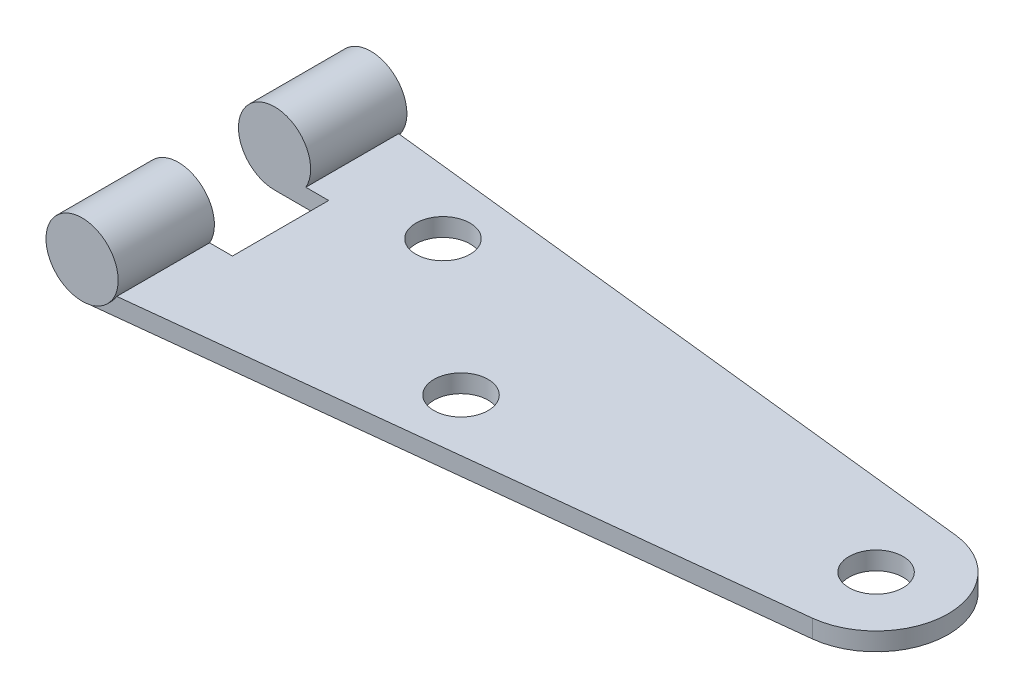
ISO-10303-21;
HEADER;
FILE_DESCRIPTION(('STEP AP214'),'2;1');
FILE_NAME('part.step','',(''),(''),'','','');
FILE_SCHEMA(('AUTOMOTIVE_DESIGN { 1 0 10303 214 1 1 1 1 }'));
ENDSEC;
DATA;
#1=APPLICATION_CONTEXT('core data for automotive mechanical design processes');
#2=APPLICATION_PROTOCOL_DEFINITION('international standard','automotive_design',2000,#1);
#3=PRODUCT_CONTEXT('',#1,'mechanical');
#4=PRODUCT('Part','Part','',(#3));
#5=PRODUCT_RELATED_PRODUCT_CATEGORY('part','',(#4));
#6=PRODUCT_DEFINITION_FORMATION('','',#4);
#7=PRODUCT_DEFINITION_CONTEXT('part definition',#1,'design');
#8=PRODUCT_DEFINITION('design','',#6,#7);
#9=PRODUCT_DEFINITION_SHAPE('','',#8);
#10=(LENGTH_UNIT() NAMED_UNIT(*) SI_UNIT(.MILLI.,.METRE.));
#11=(NAMED_UNIT(*) PLANE_ANGLE_UNIT() SI_UNIT($,.RADIAN.));
#12=(NAMED_UNIT(*) SI_UNIT($,.STERADIAN.) SOLID_ANGLE_UNIT());
#13=UNCERTAINTY_MEASURE_WITH_UNIT(LENGTH_MEASURE(1.E-05),#10,'distance_accuracy_value','');
#14=(GEOMETRIC_REPRESENTATION_CONTEXT(3) GLOBAL_UNCERTAINTY_ASSIGNED_CONTEXT((#13)) GLOBAL_UNIT_ASSIGNED_CONTEXT((#10,
#11,#12)) REPRESENTATION_CONTEXT('',''));
#15=CARTESIAN_POINT('',(0.,0.,0.));
#16=DIRECTION('',(0.,0.,1.));
#17=DIRECTION('',(1.,0.,0.));
#18=AXIS2_PLACEMENT_3D('',#15,#16,#17);
#19=CARTESIAN_POINT('',(-57.15,3.175,-12.7));
#20=DIRECTION('',(0.,0.,-1.));
#21=DIRECTION('',(-1.,0.,0.));
#22=AXIS2_PLACEMENT_3D('',#19,#20,#21);
#23=CYLINDRICAL_SURFACE('',#22,3.175);
#24=CARTESIAN_POINT('',(-57.15,3.175,-4.23333333333333));
#25=DIRECTION('',(0.,0.,-1.));
#26=DIRECTION('',(-1.,0.,0.));
#27=AXIS2_PLACEMENT_3D('',#24,#25,#26);
#28=CIRCLE('',#27,3.175);
#29=CARTESIAN_POINT('',(-54.4003693429844,1.5875,-4.23333333333333));
#30=VERTEX_POINT('',#29);
#31=CARTESIAN_POINT('',(-57.15,0.,-4.23333333333333));
#32=VERTEX_POINT('',#31);
#33=EDGE_CURVE('E44',#30,#32,#28,.F.);
#34=ORIENTED_EDGE('',*,*,#33,.F.);
#35=DIRECTION('',(0.,0.,-1.));
#36=VECTOR('',#35,1.);
#37=CARTESIAN_POINT('',(-54.4003693429844,1.5875,-12.7));
#38=LINE('',#37,#36);
#39=CARTESIAN_POINT('',(-54.4003693429844,1.5875,-12.3963428676451));
#40=VERTEX_POINT('',#39);
#41=EDGE_CURVE('E143',#30,#40,#38,.T.);
#42=ORIENTED_EDGE('',*,*,#41,.T.);
#43=CARTESIAN_POINT('',(-57.15,3.175,-12.7));
#44=DIRECTION('',(-0.109768267997922,0.,0.993957205990649));
#45=DIRECTION('',(-0.993957205990649,0.,-0.109768267997922));
#46=AXIS2_PLACEMENT_3D('',#43,#44,#45);
#47=ELLIPSE('',#46,3.19430251208408,3.175);
#48=CARTESIAN_POINT('',(-57.15,0.,-12.7));
#49=VERTEX_POINT('',#48);
#50=EDGE_CURVE('E136',#49,#40,#47,.T.);
#51=ORIENTED_EDGE('',*,*,#50,.F.);
#52=CARTESIAN_POINT('',(-57.15,3.175,-12.7));
#53=DIRECTION('',(0.,0.,-1.));
#54=DIRECTION('',(-1.,0.,0.));
#55=AXIS2_PLACEMENT_3D('',#52,#53,#54);
#56=CIRCLE('',#55,3.175);
#57=EDGE_CURVE('E135',#49,#49,#56,.T.);
#58=ORIENTED_EDGE('',*,*,#57,.F.);
#59=DIRECTION('',(0.,0.,1.));
#60=VECTOR('',#59,1.);
#61=CARTESIAN_POINT('',(-57.15,0.,-12.7));
#62=LINE('',#61,#60);
#63=EDGE_CURVE('E93',#49,#32,#62,.T.);
#64=ORIENTED_EDGE('',*,*,#63,.T.);
#65=EDGE_LOOP('',(#34,#42,#51,#58,#64));
#66=FACE_BOUND('',#65,.T.);
#67=ADVANCED_FACE('F35',(#66),#23,.T.);
#68=CARTESIAN_POINT('',(0.,1.5875,0.));
#69=DIRECTION('',(0.,1.,0.));
#70=DIRECTION('',(0.,0.,1.));
#71=AXIS2_PLACEMENT_3D('',#68,#69,#70);
#72=PLANE('',#71);
#73=DIRECTION('',(1.,0.,0.));
#74=VECTOR('',#73,1.);
#75=CARTESIAN_POINT('',(0.,1.5875,4.23333333333332));
#76=LINE('',#75,#74);
#77=CARTESIAN_POINT('',(-54.4003693429844,1.5875,4.23333333333333));
#78=VERTEX_POINT('',#77);
#79=CARTESIAN_POINT('',(-52.3875,1.5875,4.23333333333333));
#80=VERTEX_POINT('',#79);
#81=EDGE_CURVE('E220',#78,#80,#76,.T.);
#82=ORIENTED_EDGE('',*,*,#81,.F.);
#83=CARTESIAN_POINT('',(-54.4003693429844,1.5875,12.3963428676451));
#84=VERTEX_POINT('',#83);
#85=EDGE_CURVE('E150',#84,#78,#38,.T.);
#86=ORIENTED_EDGE('',*,*,#85,.F.);
#87=DIRECTION('',(0.993957205990649,0.,-0.109768267997922));
#88=VECTOR('',#87,1.);
#89=CARTESIAN_POINT('',(-57.15,1.5875,12.7));
#90=LINE('',#89,#88);
#91=CARTESIAN_POINT('',(0.697028501786803,1.5875,6.31162825804061));
#92=VERTEX_POINT('',#91);
#93=EDGE_CURVE('E167',#84,#92,#90,.T.);
#94=ORIENTED_EDGE('',*,*,#93,.T.);
#95=CARTESIAN_POINT('',(0.,1.5875,0.));
#96=DIRECTION('',(0.,1.,0.));
#97=DIRECTION('',(0.,0.,1.));
#98=AXIS2_PLACEMENT_3D('',#95,#96,#97);
#99=CIRCLE('',#98,6.35);
#100=CARTESIAN_POINT('',(0.697028501786803,1.5875,-6.31162825804062));
#101=VERTEX_POINT('',#100);
#102=EDGE_CURVE('E52',#92,#101,#99,.T.);
#103=ORIENTED_EDGE('',*,*,#102,.T.);
#104=DIRECTION('',(-0.993957205990649,0.,-0.109768267997922));
#105=VECTOR('',#104,1.);
#106=CARTESIAN_POINT('',(-57.15,1.5875,-12.7));
#107=LINE('',#106,#105);
#108=EDGE_CURVE('E79',#101,#40,#107,.T.);
#109=ORIENTED_EDGE('',*,*,#108,.T.);
#110=ORIENTED_EDGE('',*,*,#41,.F.);
#111=DIRECTION('',(-1.,0.,0.));
#112=VECTOR('',#111,1.);
#113=CARTESIAN_POINT('',(0.,1.5875,-4.23333333333334));
#114=LINE('',#113,#112);
#115=CARTESIAN_POINT('',(-52.3875,1.5875,-4.23333333333333));
#116=VERTEX_POINT('',#115);
#117=EDGE_CURVE('E120',#116,#30,#114,.T.);
#118=ORIENTED_EDGE('',*,*,#117,.F.);
#119=DIRECTION('',(0.,0.,-1.));
#120=VECTOR('',#119,1.);
#121=CARTESIAN_POINT('',(-52.3875,1.5875,0.));
#122=LINE('',#121,#120);
#123=EDGE_CURVE('E146',#80,#116,#122,.T.);
#124=ORIENTED_EDGE('',*,*,#123,.F.);
#125=EDGE_LOOP('',(#82,#86,#94,#103,#109,#110,#118,#124));
#126=FACE_BOUND('',#125,.T.);
#127=CARTESIAN_POINT('',(-44.45,1.5875,-6.35));
#128=DIRECTION('',(0.,1.,0.));
#129=DIRECTION('',(0.,0.,1.));
#130=AXIS2_PLACEMENT_3D('',#127,#128,#129);
#131=CIRCLE('',#130,2.38125);
#132=CARTESIAN_POINT('',(-44.45,1.5875,-3.96875));
#133=VERTEX_POINT('',#132);
#134=EDGE_CURVE('E160',#133,#133,#131,.T.);
#135=ORIENTED_EDGE('',*,*,#134,.F.);
#136=EDGE_LOOP('',(#135));
#137=FACE_BOUND('',#136,.T.);
#138=CARTESIAN_POINT('',(0.,1.5875,0.));
#139=DIRECTION('',(0.,1.,0.));
#140=DIRECTION('',(0.,0.,1.));
#141=AXIS2_PLACEMENT_3D('',#138,#139,#140);
#142=CIRCLE('',#141,2.38125);
#143=CARTESIAN_POINT('',(0.,1.5875,2.38125));
#144=VERTEX_POINT('',#143);
#145=EDGE_CURVE('E95',#144,#144,#142,.T.);
#146=ORIENTED_EDGE('',*,*,#145,.F.);
#147=EDGE_LOOP('',(#146));
#148=FACE_BOUND('',#147,.T.);
#149=CARTESIAN_POINT('',(-31.75,1.5875,4.7625));
#150=DIRECTION('',(0.,1.,0.));
#151=DIRECTION('',(0.,0.,1.));
#152=AXIS2_PLACEMENT_3D('',#149,#150,#151);
#153=CIRCLE('',#152,2.38125);
#154=CARTESIAN_POINT('',(-31.75,1.5875,7.14375));
#155=VERTEX_POINT('',#154);
#156=EDGE_CURVE('E154',#155,#155,#153,.T.);
#157=ORIENTED_EDGE('',*,*,#156,.F.);
#158=EDGE_LOOP('',(#157));
#159=FACE_BOUND('',#158,.T.);
#160=ADVANCED_FACE('F171',(#126,#137,#148,#159),#72,.T.);
#161=CARTESIAN_POINT('',(0.,0.,0.));
#162=DIRECTION('',(0.,1.,0.));
#163=DIRECTION('',(0.,0.,1.));
#164=AXIS2_PLACEMENT_3D('',#161,#162,#163);
#165=PLANE('',#164);
#166=CARTESIAN_POINT('',(-44.45,0.,-6.35));
#167=DIRECTION('',(0.,1.,0.));
#168=DIRECTION('',(0.,0.,1.));
#169=AXIS2_PLACEMENT_3D('',#166,#167,#168);
#170=CIRCLE('',#169,2.38125);
#171=CARTESIAN_POINT('',(-44.45,0.,-3.96875));
#172=VERTEX_POINT('',#171);
#173=EDGE_CURVE('E157',#172,#172,#170,.T.);
#174=ORIENTED_EDGE('',*,*,#173,.T.);
#175=EDGE_LOOP('',(#174));
#176=FACE_BOUND('',#175,.T.);
#177=CARTESIAN_POINT('',(-57.15,0.,4.23333333333333));
#178=VERTEX_POINT('',#177);
#179=CARTESIAN_POINT('',(-57.15,0.,12.7));
#180=VERTEX_POINT('',#179);
#181=EDGE_CURVE('E94',#178,#180,#62,.T.);
#182=ORIENTED_EDGE('',*,*,#181,.F.);
#183=DIRECTION('',(1.,0.,0.));
#184=VECTOR('',#183,1.);
#185=CARTESIAN_POINT('',(-52.3875,0.,4.23333333333333));
#186=LINE('',#185,#184);
#187=CARTESIAN_POINT('',(-52.3875,0.,4.23333333333333));
#188=VERTEX_POINT('',#187);
#189=EDGE_CURVE('E130',#178,#188,#186,.T.);
#190=ORIENTED_EDGE('',*,*,#189,.T.);
#191=DIRECTION('',(0.,0.,-1.));
#192=VECTOR('',#191,1.);
#193=CARTESIAN_POINT('',(-52.3875,0.,-4.23333333333333));
#194=LINE('',#193,#192);
#195=CARTESIAN_POINT('',(-52.3875,0.,-4.23333333333333));
#196=VERTEX_POINT('',#195);
#197=EDGE_CURVE('E129',#188,#196,#194,.T.);
#198=ORIENTED_EDGE('',*,*,#197,.T.);
#199=DIRECTION('',(-1.,0.,0.));
#200=VECTOR('',#199,1.);
#201=CARTESIAN_POINT('',(-52.3875,0.,-4.23333333333333));
#202=LINE('',#201,#200);
#203=EDGE_CURVE('E116',#196,#32,#202,.T.);
#204=ORIENTED_EDGE('',*,*,#203,.T.);
#205=ORIENTED_EDGE('',*,*,#63,.F.);
#206=DIRECTION('',(-0.993957205990649,0.,-0.109768267997922));
#207=VECTOR('',#206,1.);
#208=CARTESIAN_POINT('',(-57.15,0.,-12.7));
#209=LINE('',#208,#207);
#210=CARTESIAN_POINT('',(0.697028501786803,0.,-6.31162825804062));
#211=VERTEX_POINT('',#210);
#212=EDGE_CURVE('E85',#211,#49,#209,.T.);
#213=ORIENTED_EDGE('',*,*,#212,.F.);
#214=CARTESIAN_POINT('',(0.,0.,0.));
#215=DIRECTION('',(0.,1.,0.));
#216=DIRECTION('',(0.,0.,1.));
#217=AXIS2_PLACEMENT_3D('',#214,#215,#216);
#218=CIRCLE('',#217,6.35);
#219=CARTESIAN_POINT('',(0.697028501786803,0.,6.31162825804061));
#220=VERTEX_POINT('',#219);
#221=EDGE_CURVE('E71',#220,#211,#218,.T.);
#222=ORIENTED_EDGE('',*,*,#221,.F.);
#223=DIRECTION('',(0.993957205990649,0.,-0.109768267997922));
#224=VECTOR('',#223,1.);
#225=CARTESIAN_POINT('',(-57.15,0.,12.7));
#226=LINE('',#225,#224);
#227=EDGE_CURVE('E66',#180,#220,#226,.T.);
#228=ORIENTED_EDGE('',*,*,#227,.F.);
#229=EDGE_LOOP('',(#182,#190,#198,#204,#205,#213,#222,#228));
#230=FACE_BOUND('',#229,.T.);
#231=CARTESIAN_POINT('',(0.,0.,0.));
#232=DIRECTION('',(0.,1.,0.));
#233=DIRECTION('',(0.,0.,1.));
#234=AXIS2_PLACEMENT_3D('',#231,#232,#233);
#235=CIRCLE('',#234,2.38125);
#236=CARTESIAN_POINT('',(0.,0.,2.38125));
#237=VERTEX_POINT('',#236);
#238=EDGE_CURVE('E99',#237,#237,#235,.T.);
#239=ORIENTED_EDGE('',*,*,#238,.T.);
#240=EDGE_LOOP('',(#239));
#241=FACE_BOUND('',#240,.T.);
#242=CARTESIAN_POINT('',(-31.75,0.,4.7625));
#243=DIRECTION('',(0.,1.,0.));
#244=DIRECTION('',(0.,0.,1.));
#245=AXIS2_PLACEMENT_3D('',#242,#243,#244);
#246=CIRCLE('',#245,2.38125);
#247=CARTESIAN_POINT('',(-31.75,0.,7.14375));
#248=VERTEX_POINT('',#247);
#249=EDGE_CURVE('E153',#248,#248,#246,.T.);
#250=ORIENTED_EDGE('',*,*,#249,.T.);
#251=EDGE_LOOP('',(#250));
#252=FACE_BOUND('',#251,.T.);
#253=ADVANCED_FACE('F89',(#176,#230,#241,#252),#165,.F.);
#254=CARTESIAN_POINT('',(-57.15,1.5875,-12.7));
#255=DIRECTION('',(-0.109768267997922,0.,0.993957205990649));
#256=DIRECTION('',(0.993957205990649,0.,0.109768267997922));
#257=AXIS2_PLACEMENT_3D('',#254,#255,#256);
#258=PLANE('',#257);
#259=ORIENTED_EDGE('',*,*,#212,.T.);
#260=ORIENTED_EDGE('',*,*,#50,.T.);
#261=ORIENTED_EDGE('',*,*,#108,.F.);
#262=DIRECTION('',(0.,-1.,0.));
#263=VECTOR('',#262,1.);
#264=CARTESIAN_POINT('',(0.697028501786803,1.5875,-6.31162825804062));
#265=LINE('',#264,#263);
#266=EDGE_CURVE('E74',#101,#211,#265,.T.);
#267=ORIENTED_EDGE('',*,*,#266,.T.);
#268=EDGE_LOOP('',(#259,#260,#261,#267));
#269=FACE_BOUND('',#268,.T.);
#270=ADVANCED_FACE('F37',(#269),#258,.F.);
#271=CARTESIAN_POINT('',(-57.15,1.5875,12.7));
#272=DIRECTION('',(-0.109768267997922,0.,-0.993957205990649));
#273=DIRECTION('',(-0.993957205990649,0.,0.109768267997922));
#274=AXIS2_PLACEMENT_3D('',#271,#272,#273);
#275=PLANE('',#274);
#276=ORIENTED_EDGE('',*,*,#93,.F.);
#277=CARTESIAN_POINT('',(-57.15,3.175,12.7));
#278=DIRECTION('',(-0.109768267997922,0.,-0.993957205990649));
#279=DIRECTION('',(0.993957205990649,0.,-0.109768267997922));
#280=AXIS2_PLACEMENT_3D('',#277,#278,#279);
#281=ELLIPSE('',#280,3.19430251208408,3.175);
#282=EDGE_CURVE('E106',#84,#180,#281,.T.);
#283=ORIENTED_EDGE('',*,*,#282,.T.);
#284=ORIENTED_EDGE('',*,*,#227,.T.);
#285=DIRECTION('',(0.,-1.,0.));
#286=VECTOR('',#285,1.);
#287=CARTESIAN_POINT('',(0.697028501786803,1.5875,6.31162825804061));
#288=LINE('',#287,#286);
#289=EDGE_CURVE('E76',#92,#220,#288,.T.);
#290=ORIENTED_EDGE('',*,*,#289,.F.);
#291=EDGE_LOOP('',(#276,#283,#284,#290));
#292=FACE_BOUND('',#291,.T.);
#293=ADVANCED_FACE('F173',(#292),#275,.F.);
#294=CARTESIAN_POINT('',(0.,1.5875,0.));
#295=DIRECTION('',(0.,-1.,0.));
#296=DIRECTION('',(0.,0.,-1.));
#297=AXIS2_PLACEMENT_3D('',#294,#295,#296);
#298=CYLINDRICAL_SURFACE('',#297,6.35);
#299=ORIENTED_EDGE('',*,*,#221,.T.);
#300=ORIENTED_EDGE('',*,*,#266,.F.);
#301=ORIENTED_EDGE('',*,*,#102,.F.);
#302=ORIENTED_EDGE('',*,*,#289,.T.);
#303=EDGE_LOOP('',(#299,#300,#301,#302));
#304=FACE_BOUND('',#303,.T.);
#305=ADVANCED_FACE('F73',(#304),#298,.T.);
#306=CARTESIAN_POINT('',(0.,1.5875,0.));
#307=DIRECTION('',(0.,-1.,0.));
#308=DIRECTION('',(0.,0.,-1.));
#309=AXIS2_PLACEMENT_3D('',#306,#307,#308);
#310=CYLINDRICAL_SURFACE('',#309,2.38125);
#311=ORIENTED_EDGE('',*,*,#145,.T.);
#312=EDGE_LOOP('',(#311));
#313=FACE_BOUND('',#312,.T.);
#314=ORIENTED_EDGE('',*,*,#238,.F.);
#315=EDGE_LOOP('',(#314));
#316=FACE_BOUND('',#315,.T.);
#317=ADVANCED_FACE('F179',(#313,#316),#310,.F.);
#318=CARTESIAN_POINT('',(-44.45,1.5875,-6.35));
#319=DIRECTION('',(0.,-1.,0.));
#320=DIRECTION('',(0.,0.,-1.));
#321=AXIS2_PLACEMENT_3D('',#318,#319,#320);
#322=CYLINDRICAL_SURFACE('',#321,2.38125);
#323=ORIENTED_EDGE('',*,*,#134,.T.);
#324=EDGE_LOOP('',(#323));
#325=FACE_BOUND('',#324,.T.);
#326=ORIENTED_EDGE('',*,*,#173,.F.);
#327=EDGE_LOOP('',(#326));
#328=FACE_BOUND('',#327,.T.);
#329=ADVANCED_FACE('F306',(#325,#328),#322,.F.);
#330=CARTESIAN_POINT('',(-31.75,1.5875,4.7625));
#331=DIRECTION('',(0.,-1.,0.));
#332=DIRECTION('',(0.,0.,-1.));
#333=AXIS2_PLACEMENT_3D('',#330,#331,#332);
#334=CYLINDRICAL_SURFACE('',#333,2.38125);
#335=ORIENTED_EDGE('',*,*,#156,.T.);
#336=EDGE_LOOP('',(#335));
#337=FACE_BOUND('',#336,.T.);
#338=ORIENTED_EDGE('',*,*,#249,.F.);
#339=EDGE_LOOP('',(#338));
#340=FACE_BOUND('',#339,.T.);
#341=ADVANCED_FACE('F200',(#337,#340),#334,.F.);
#342=CARTESIAN_POINT('',(-57.15,3.175,-12.7));
#343=DIRECTION('',(0.,0.,-1.));
#344=DIRECTION('',(-1.,0.,0.));
#345=AXIS2_PLACEMENT_3D('',#342,#343,#344);
#346=PLANE('',#345);
#347=ORIENTED_EDGE('',*,*,#57,.T.);
#348=EDGE_LOOP('',(#347));
#349=FACE_BOUND('',#348,.T.);
#350=ADVANCED_FACE('F192',(#349),#346,.T.);
#351=CARTESIAN_POINT('',(-57.15,3.175,4.23333333333333));
#352=DIRECTION('',(0.,0.,1.));
#353=DIRECTION('',(1.,0.,0.));
#354=AXIS2_PLACEMENT_3D('',#351,#352,#353);
#355=CIRCLE('',#354,3.175);
#356=EDGE_CURVE('E11',#178,#78,#355,.F.);
#357=ORIENTED_EDGE('',*,*,#356,.F.);
#358=ORIENTED_EDGE('',*,*,#181,.T.);
#359=CARTESIAN_POINT('',(-57.15,3.175,12.7));
#360=DIRECTION('',(0.,0.,-1.));
#361=DIRECTION('',(-1.,0.,0.));
#362=AXIS2_PLACEMENT_3D('',#359,#360,#361);
#363=CIRCLE('',#362,3.175);
#364=EDGE_CURVE('E141',#180,#180,#363,.T.);
#365=ORIENTED_EDGE('',*,*,#364,.T.);
#366=ORIENTED_EDGE('',*,*,#282,.F.);
#367=ORIENTED_EDGE('',*,*,#85,.T.);
#368=EDGE_LOOP('',(#357,#358,#365,#366,#367));
#369=FACE_BOUND('',#368,.T.);
#370=ADVANCED_FACE('F183',(#369),#23,.T.);
#371=CARTESIAN_POINT('',(-57.15,3.175,12.7));
#372=DIRECTION('',(0.,0.,1.));
#373=DIRECTION('',(1.,0.,0.));
#374=AXIS2_PLACEMENT_3D('',#371,#372,#373);
#375=PLANE('',#374);
#376=ORIENTED_EDGE('',*,*,#364,.F.);
#377=EDGE_LOOP('',(#376));
#378=FACE_BOUND('',#377,.T.);
#379=ADVANCED_FACE('F191',(#378),#375,.T.);
#380=CARTESIAN_POINT('',(-52.3875,0.,-4.23333333333333));
#381=DIRECTION('',(1.,0.,0.));
#382=DIRECTION('',(0.,0.,-1.));
#383=AXIS2_PLACEMENT_3D('',#380,#381,#382);
#384=PLANE('',#383);
#385=ORIENTED_EDGE('',*,*,#123,.T.);
#386=DIRECTION('',(0.,1.,0.));
#387=VECTOR('',#386,1.);
#388=CARTESIAN_POINT('',(-52.3875,0.,-4.23333333333333));
#389=LINE('',#388,#387);
#390=EDGE_CURVE('E213',#196,#116,#389,.T.);
#391=ORIENTED_EDGE('',*,*,#390,.F.);
#392=ORIENTED_EDGE('',*,*,#197,.F.);
#393=DIRECTION('',(0.,1.,0.));
#394=VECTOR('',#393,1.);
#395=CARTESIAN_POINT('',(-52.3875,0.,4.23333333333333));
#396=LINE('',#395,#394);
#397=EDGE_CURVE('E212',#188,#80,#396,.T.);
#398=ORIENTED_EDGE('',*,*,#397,.T.);
#399=EDGE_LOOP('',(#385,#391,#392,#398));
#400=FACE_BOUND('',#399,.T.);
#401=ADVANCED_FACE('F198',(#400),#384,.F.);
#402=CARTESIAN_POINT('',(-52.3875,0.,4.23333333333333));
#403=DIRECTION('',(0.,0.,1.));
#404=DIRECTION('',(1.,0.,0.));
#405=AXIS2_PLACEMENT_3D('',#402,#403,#404);
#406=PLANE('',#405);
#407=ORIENTED_EDGE('',*,*,#81,.T.);
#408=ORIENTED_EDGE('',*,*,#397,.F.);
#409=ORIENTED_EDGE('',*,*,#189,.F.);
#410=ORIENTED_EDGE('',*,*,#356,.T.);
#411=EDGE_LOOP('',(#407,#408,#409,#410));
#412=FACE_BOUND('',#411,.T.);
#413=ADVANCED_FACE('F210',(#412),#406,.F.);
#414=CARTESIAN_POINT('',(-52.3875,0.,-4.23333333333333));
#415=DIRECTION('',(0.,0.,-1.));
#416=DIRECTION('',(-1.,0.,0.));
#417=AXIS2_PLACEMENT_3D('',#414,#415,#416);
#418=PLANE('',#417);
#419=ORIENTED_EDGE('',*,*,#117,.T.);
#420=ORIENTED_EDGE('',*,*,#33,.T.);
#421=ORIENTED_EDGE('',*,*,#203,.F.);
#422=ORIENTED_EDGE('',*,*,#390,.T.);
#423=EDGE_LOOP('',(#419,#420,#421,#422));
#424=FACE_BOUND('',#423,.T.);
#425=ADVANCED_FACE('F113',(#424),#418,.F.);
#426=CLOSED_SHELL('',(#67,#160,#253,#270,#293,#305,#317,#329,#341,#350,#370,#379,#401,#413,#425));
#427=MANIFOLD_SOLID_BREP('B2',#426);
#428=ADVANCED_BREP_SHAPE_REPRESENTATION('',(#18,#427),#14);
#429=SHAPE_DEFINITION_REPRESENTATION(#9,#428);
ENDSEC;
END-ISO-10303-21;
